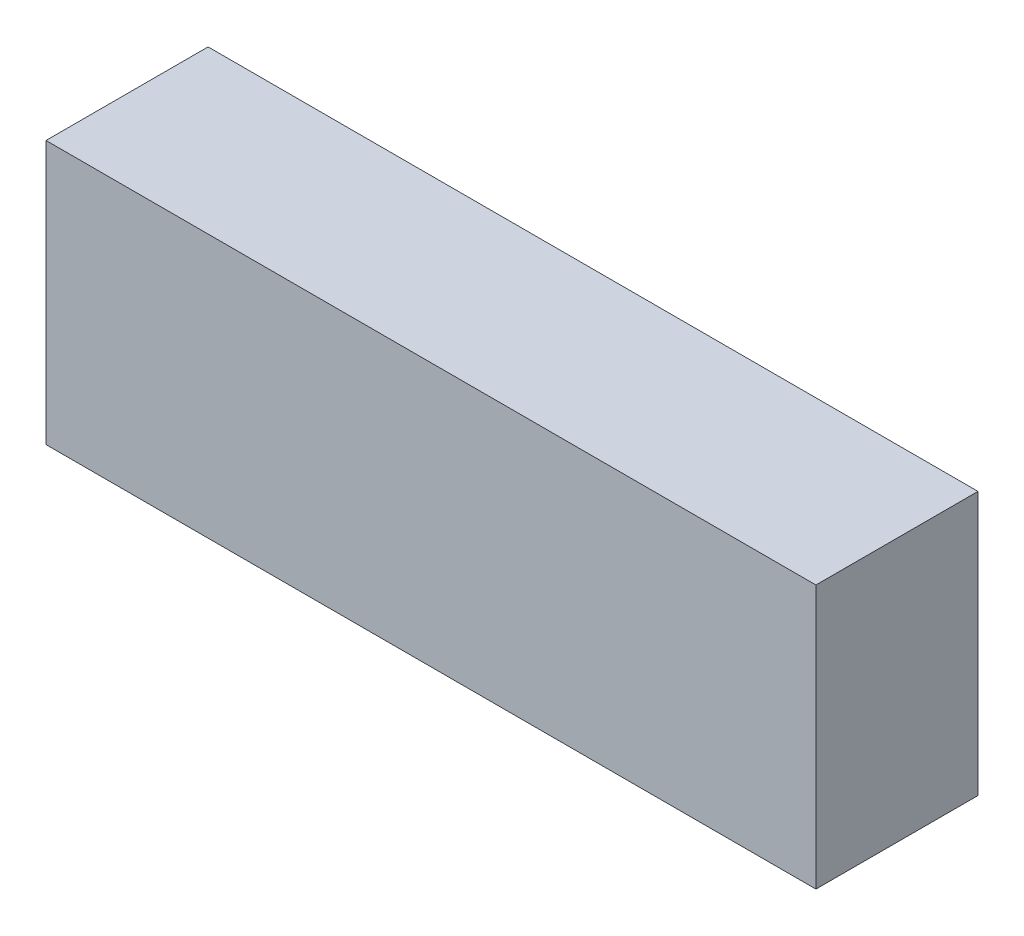
ISO-10303-21;
HEADER;
FILE_DESCRIPTION(('STEP AP214'),'2;1');
FILE_NAME('part.step','',(''),(''),'','','');
FILE_SCHEMA(('AUTOMOTIVE_DESIGN { 1 0 10303 214 1 1 1 1 }'));
ENDSEC;
DATA;
#1=APPLICATION_CONTEXT('core data for automotive mechanical design processes');
#2=APPLICATION_PROTOCOL_DEFINITION('international standard','automotive_design',2000,#1);
#3=PRODUCT_CONTEXT('',#1,'mechanical');
#4=PRODUCT('Part','Part','',(#3));
#5=PRODUCT_RELATED_PRODUCT_CATEGORY('part','',(#4));
#6=PRODUCT_DEFINITION_FORMATION('','',#4);
#7=PRODUCT_DEFINITION_CONTEXT('part definition',#1,'design');
#8=PRODUCT_DEFINITION('design','',#6,#7);
#9=PRODUCT_DEFINITION_SHAPE('','',#8);
#10=(LENGTH_UNIT() NAMED_UNIT(*) SI_UNIT(.MILLI.,.METRE.));
#11=(NAMED_UNIT(*) PLANE_ANGLE_UNIT() SI_UNIT($,.RADIAN.));
#12=(NAMED_UNIT(*) SI_UNIT($,.STERADIAN.) SOLID_ANGLE_UNIT());
#13=UNCERTAINTY_MEASURE_WITH_UNIT(LENGTH_MEASURE(1.E-05),#10,'distance_accuracy_value','');
#14=(GEOMETRIC_REPRESENTATION_CONTEXT(3) GLOBAL_UNCERTAINTY_ASSIGNED_CONTEXT((#13)) GLOBAL_UNIT_ASSIGNED_CONTEXT((#10,
#11,#12)) REPRESENTATION_CONTEXT('',''));
#15=CARTESIAN_POINT('',(0.,0.,0.));
#16=DIRECTION('',(0.,0.,1.));
#17=DIRECTION('',(1.,0.,0.));
#18=AXIS2_PLACEMENT_3D('',#15,#16,#17);
#19=CARTESIAN_POINT('',(-1900.,2591.64878389476,0.));
#20=DIRECTION('',(1.,0.,0.));
#21=DIRECTION('',(0.,0.,1.));
#22=AXIS2_PLACEMENT_3D('',#19,#20,#21);
#23=PLANE('',#22);
#24=DIRECTION('',(0.,-1.,0.));
#25=VECTOR('',#24,1.);
#26=CARTESIAN_POINT('',(-1900.,2591.64878389476,-10.));
#27=LINE('',#26,#25);
#28=CARTESIAN_POINT('',(-1900.,630.,-10.));
#29=VERTEX_POINT('',#28);
#30=CARTESIAN_POINT('',(-1900.,0.,-10.));
#31=VERTEX_POINT('',#30);
#32=EDGE_CURVE('E124',#29,#31,#27,.T.);
#33=ORIENTED_EDGE('',*,*,#32,.T.);
#34=DIRECTION('',(0.,0.,-1.));
#35=VECTOR('',#34,1.);
#36=CARTESIAN_POINT('',(-1900.,0.,0.));
#37=LINE('',#36,#35);
#38=CARTESIAN_POINT('',(-1900.,0.,0.));
#39=VERTEX_POINT('',#38);
#40=EDGE_CURVE('E127',#39,#31,#37,.T.);
#41=ORIENTED_EDGE('',*,*,#40,.F.);
#42=DIRECTION('',(0.,-1.,0.));
#43=VECTOR('',#42,1.);
#44=CARTESIAN_POINT('',(-1900.,2591.64878389476,0.));
#45=LINE('',#44,#43);
#46=CARTESIAN_POINT('',(-1900.,650.,0.));
#47=VERTEX_POINT('',#46);
#48=EDGE_CURVE('E39',#47,#39,#45,.T.);
#49=ORIENTED_EDGE('',*,*,#48,.F.);
#50=DIRECTION('',(0.,0.,-1.));
#51=VECTOR('',#50,1.);
#52=CARTESIAN_POINT('',(-1900.,650.,0.));
#53=LINE('',#52,#51);
#54=CARTESIAN_POINT('',(-1900.,650.,-400.));
#55=VERTEX_POINT('',#54);
#56=EDGE_CURVE('E118',#47,#55,#53,.T.);
#57=ORIENTED_EDGE('',*,*,#56,.T.);
#58=DIRECTION('',(0.,1.,0.));
#59=VECTOR('',#58,1.);
#60=CARTESIAN_POINT('',(-1900.,630.,-400.));
#61=LINE('',#60,#59);
#62=CARTESIAN_POINT('',(-1900.,630.,-400.));
#63=VERTEX_POINT('',#62);
#64=EDGE_CURVE('E116',#63,#55,#61,.T.);
#65=ORIENTED_EDGE('',*,*,#64,.F.);
#66=DIRECTION('',(0.,0.,-1.));
#67=VECTOR('',#66,1.);
#68=CARTESIAN_POINT('',(-1900.,630.,0.));
#69=LINE('',#68,#67);
#70=EDGE_CURVE('E151',#29,#63,#69,.T.);
#71=ORIENTED_EDGE('',*,*,#70,.F.);
#72=EDGE_LOOP('',(#33,#41,#49,#57,#65,#71));
#73=FACE_BOUND('',#72,.T.);
#74=ADVANCED_FACE('F35',(#73),#23,.F.);
#75=CARTESIAN_POINT('',(-1900.,2591.64878389476,-10.));
#76=DIRECTION('',(0.,0.,1.));
#77=DIRECTION('',(-1.,0.,0.));
#78=AXIS2_PLACEMENT_3D('',#75,#76,#77);
#79=PLANE('',#78);
#80=DIRECTION('',(0.,-1.,0.));
#81=VECTOR('',#80,1.);
#82=CARTESIAN_POINT('',(-10.,2591.64878389476,-10.));
#83=LINE('',#82,#81);
#84=CARTESIAN_POINT('',(-10.,630.,-10.));
#85=VERTEX_POINT('',#84);
#86=CARTESIAN_POINT('',(-10.,0.,-10.));
#87=VERTEX_POINT('',#86);
#88=EDGE_CURVE('E128',#85,#87,#83,.T.);
#89=ORIENTED_EDGE('',*,*,#88,.T.);
#90=DIRECTION('',(1.,0.,0.));
#91=VECTOR('',#90,1.);
#92=CARTESIAN_POINT('',(-1900.,0.,-10.));
#93=LINE('',#92,#91);
#94=EDGE_CURVE('E80',#31,#87,#93,.T.);
#95=ORIENTED_EDGE('',*,*,#94,.F.);
#96=ORIENTED_EDGE('',*,*,#32,.F.);
#97=DIRECTION('',(-1.,0.,0.));
#98=VECTOR('',#97,1.);
#99=CARTESIAN_POINT('',(-1900.,630.,-10.));
#100=LINE('',#99,#98);
#101=EDGE_CURVE('E142',#85,#29,#100,.T.);
#102=ORIENTED_EDGE('',*,*,#101,.F.);
#103=EDGE_LOOP('',(#89,#95,#96,#102));
#104=FACE_BOUND('',#103,.T.);
#105=ADVANCED_FACE('F157',(#104),#79,.F.);
#106=CARTESIAN_POINT('',(-10.,2591.64878389476,-10.));
#107=DIRECTION('',(1.,0.,0.));
#108=DIRECTION('',(0.,0.,1.));
#109=AXIS2_PLACEMENT_3D('',#106,#107,#108);
#110=PLANE('',#109);
#111=DIRECTION('',(0.,-1.,0.));
#112=VECTOR('',#111,1.);
#113=CARTESIAN_POINT('',(-9.99999999999995,2591.64878389476,-400.));
#114=LINE('',#113,#112);
#115=CARTESIAN_POINT('',(-9.99999999999995,630.,-400.));
#116=VERTEX_POINT('',#115);
#117=CARTESIAN_POINT('',(-9.99999999999995,0.,-400.));
#118=VERTEX_POINT('',#117);
#119=EDGE_CURVE('E131',#116,#118,#114,.T.);
#120=ORIENTED_EDGE('',*,*,#119,.T.);
#121=DIRECTION('',(0.,0.,-1.));
#122=VECTOR('',#121,1.);
#123=CARTESIAN_POINT('',(-10.,0.,-10.));
#124=LINE('',#123,#122);
#125=EDGE_CURVE('E130',#87,#118,#124,.T.);
#126=ORIENTED_EDGE('',*,*,#125,.F.);
#127=ORIENTED_EDGE('',*,*,#88,.F.);
#128=DIRECTION('',(0.,0.,1.));
#129=VECTOR('',#128,1.);
#130=CARTESIAN_POINT('',(-10.,630.,-10.));
#131=LINE('',#130,#129);
#132=EDGE_CURVE('E92',#116,#85,#131,.T.);
#133=ORIENTED_EDGE('',*,*,#132,.F.);
#134=EDGE_LOOP('',(#120,#126,#127,#133));
#135=FACE_BOUND('',#134,.T.);
#136=ADVANCED_FACE('F160',(#135),#110,.F.);
#137=CARTESIAN_POINT('',(-9.99999999999995,2591.64878389476,-400.));
#138=DIRECTION('',(0.,0.,1.));
#139=DIRECTION('',(-1.,0.,0.));
#140=AXIS2_PLACEMENT_3D('',#137,#138,#139);
#141=PLANE('',#140);
#142=DIRECTION('',(1.,0.,0.));
#143=VECTOR('',#142,1.);
#144=CARTESIAN_POINT('',(-9.99999999999995,0.,-400.));
#145=LINE('',#144,#143);
#146=CARTESIAN_POINT('',(0.,0.,-400.));
#147=VERTEX_POINT('',#146);
#148=EDGE_CURVE('E111',#118,#147,#145,.T.);
#149=ORIENTED_EDGE('',*,*,#148,.F.);
#150=ORIENTED_EDGE('',*,*,#119,.F.);
#151=DIRECTION('',(1.,0.,0.));
#152=VECTOR('',#151,1.);
#153=CARTESIAN_POINT('',(0.,630.,-400.));
#154=LINE('',#153,#152);
#155=EDGE_CURVE('E149',#63,#116,#154,.T.);
#156=ORIENTED_EDGE('',*,*,#155,.F.);
#157=ORIENTED_EDGE('',*,*,#64,.T.);
#158=DIRECTION('',(1.,0.,0.));
#159=VECTOR('',#158,1.);
#160=CARTESIAN_POINT('',(-9.99999999999995,650.,-400.));
#161=LINE('',#160,#159);
#162=CARTESIAN_POINT('',(0.,650.,-400.));
#163=VERTEX_POINT('',#162);
#164=EDGE_CURVE('E44',#55,#163,#161,.T.);
#165=ORIENTED_EDGE('',*,*,#164,.T.);
#166=DIRECTION('',(0.,-1.,0.));
#167=VECTOR('',#166,1.);
#168=CARTESIAN_POINT('',(0.,2591.64878389476,-400.));
#169=LINE('',#168,#167);
#170=EDGE_CURVE('E106',#163,#147,#169,.T.);
#171=ORIENTED_EDGE('',*,*,#170,.T.);
#172=EDGE_LOOP('',(#149,#150,#156,#157,#165,#171));
#173=FACE_BOUND('',#172,.T.);
#174=ADVANCED_FACE('F113',(#173),#141,.F.);
#175=CARTESIAN_POINT('',(0.,2591.64878389476,0.));
#176=DIRECTION('',(-1.,0.,0.));
#177=DIRECTION('',(0.,0.,-1.));
#178=AXIS2_PLACEMENT_3D('',#175,#176,#177);
#179=PLANE('',#178);
#180=DIRECTION('',(0.,0.,1.));
#181=VECTOR('',#180,1.);
#182=CARTESIAN_POINT('',(0.,0.,0.));
#183=LINE('',#182,#181);
#184=CARTESIAN_POINT('',(0.,0.,0.));
#185=VERTEX_POINT('',#184);
#186=EDGE_CURVE('E108',#147,#185,#183,.T.);
#187=ORIENTED_EDGE('',*,*,#186,.F.);
#188=ORIENTED_EDGE('',*,*,#170,.F.);
#189=DIRECTION('',(0.,0.,1.));
#190=VECTOR('',#189,1.);
#191=CARTESIAN_POINT('',(0.,650.,0.));
#192=LINE('',#191,#190);
#193=CARTESIAN_POINT('',(0.,650.,0.));
#194=VERTEX_POINT('',#193);
#195=EDGE_CURVE('E11',#163,#194,#192,.T.);
#196=ORIENTED_EDGE('',*,*,#195,.T.);
#197=DIRECTION('',(0.,-1.,0.));
#198=VECTOR('',#197,1.);
#199=CARTESIAN_POINT('',(0.,2591.64878389476,0.));
#200=LINE('',#199,#198);
#201=EDGE_CURVE('E133',#194,#185,#200,.T.);
#202=ORIENTED_EDGE('',*,*,#201,.T.);
#203=EDGE_LOOP('',(#187,#188,#196,#202));
#204=FACE_BOUND('',#203,.T.);
#205=ADVANCED_FACE('F107',(#204),#179,.F.);
#206=CARTESIAN_POINT('',(-1900.,2591.64878389476,0.));
#207=DIRECTION('',(0.,0.,-1.));
#208=DIRECTION('',(1.,0.,0.));
#209=AXIS2_PLACEMENT_3D('',#206,#207,#208);
#210=PLANE('',#209);
#211=DIRECTION('',(-1.,0.,0.));
#212=VECTOR('',#211,1.);
#213=CARTESIAN_POINT('',(-1900.,0.,0.));
#214=LINE('',#213,#212);
#215=EDGE_CURVE('E58',#185,#39,#214,.T.);
#216=ORIENTED_EDGE('',*,*,#215,.F.);
#217=ORIENTED_EDGE('',*,*,#201,.F.);
#218=DIRECTION('',(-1.,0.,0.));
#219=VECTOR('',#218,1.);
#220=CARTESIAN_POINT('',(-1900.,650.,0.));
#221=LINE('',#220,#219);
#222=EDGE_CURVE('E52',#194,#47,#221,.T.);
#223=ORIENTED_EDGE('',*,*,#222,.T.);
#224=ORIENTED_EDGE('',*,*,#48,.T.);
#225=EDGE_LOOP('',(#216,#217,#223,#224));
#226=FACE_BOUND('',#225,.T.);
#227=ADVANCED_FACE('F164',(#226),#210,.F.);
#228=CARTESIAN_POINT('',(0.,0.,0.));
#229=DIRECTION('',(0.,1.,0.));
#230=DIRECTION('',(0.,0.,-1.));
#231=AXIS2_PLACEMENT_3D('',#228,#229,#230);
#232=PLANE('',#231);
#233=ORIENTED_EDGE('',*,*,#40,.T.);
#234=ORIENTED_EDGE('',*,*,#94,.T.);
#235=ORIENTED_EDGE('',*,*,#125,.T.);
#236=ORIENTED_EDGE('',*,*,#148,.T.);
#237=ORIENTED_EDGE('',*,*,#186,.T.);
#238=ORIENTED_EDGE('',*,*,#215,.T.);
#239=EDGE_LOOP('',(#233,#234,#235,#236,#237,#238));
#240=FACE_BOUND('',#239,.T.);
#241=ADVANCED_FACE('F162',(#240),#232,.F.);
#242=CARTESIAN_POINT('',(-2100.,650.,-400.));
#243=DIRECTION('',(0.,1.,0.));
#244=DIRECTION('',(0.,0.,-1.));
#245=AXIS2_PLACEMENT_3D('',#242,#243,#244);
#246=PLANE('',#245);
#247=ORIENTED_EDGE('',*,*,#222,.F.);
#248=ORIENTED_EDGE('',*,*,#195,.F.);
#249=ORIENTED_EDGE('',*,*,#164,.F.);
#250=ORIENTED_EDGE('',*,*,#56,.F.);
#251=EDGE_LOOP('',(#247,#248,#249,#250));
#252=FACE_BOUND('',#251,.T.);
#253=ADVANCED_FACE('F37',(#252),#246,.T.);
#254=CARTESIAN_POINT('',(0.,630.,0.));
#255=DIRECTION('',(0.,-1.,0.));
#256=DIRECTION('',(0.,0.,1.));
#257=AXIS2_PLACEMENT_3D('',#254,#255,#256);
#258=PLANE('',#257);
#259=ORIENTED_EDGE('',*,*,#101,.T.);
#260=ORIENTED_EDGE('',*,*,#70,.T.);
#261=ORIENTED_EDGE('',*,*,#155,.T.);
#262=ORIENTED_EDGE('',*,*,#132,.T.);
#263=EDGE_LOOP('',(#259,#260,#261,#262));
#264=FACE_BOUND('',#263,.T.);
#265=ADVANCED_FACE('F153',(#264),#258,.T.);
#266=CLOSED_SHELL('',(#74,#105,#136,#174,#205,#227,#241,#253,#265));
#267=MANIFOLD_SOLID_BREP('B2',#266);
#268=ADVANCED_BREP_SHAPE_REPRESENTATION('',(#18,#267),#14);
#269=SHAPE_DEFINITION_REPRESENTATION(#9,#268);
ENDSEC;
END-ISO-10303-21;
